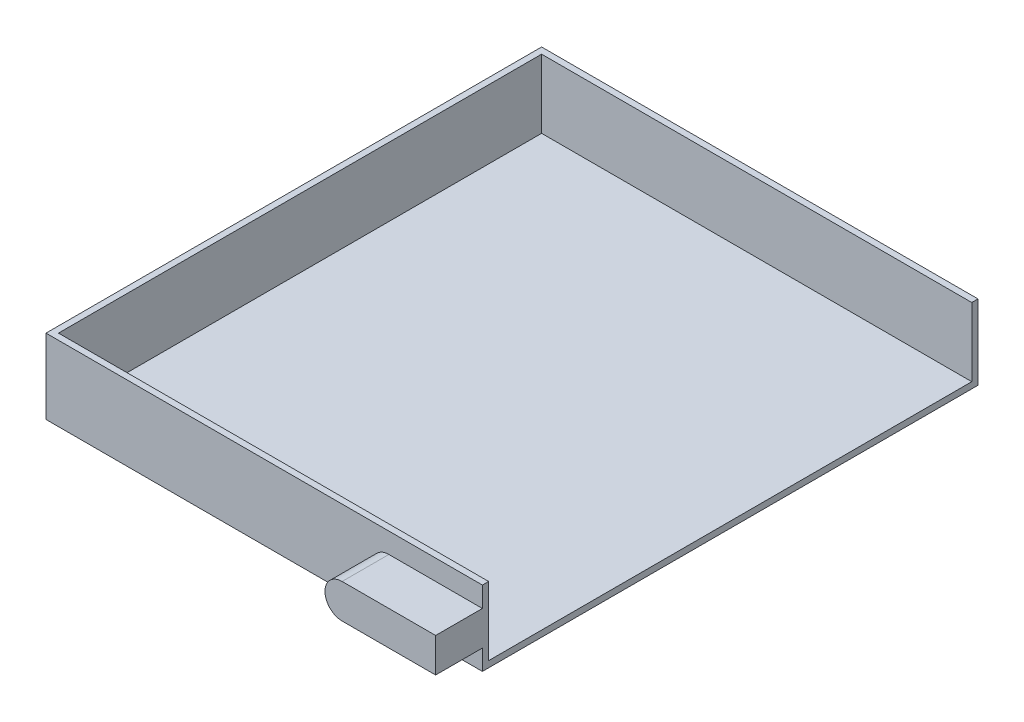
ISO-10303-21;
HEADER;
FILE_DESCRIPTION(('STEP AP214'),'2;1');
FILE_NAME('part.step','',(''),(''),'','','');
FILE_SCHEMA(('AUTOMOTIVE_DESIGN { 1 0 10303 214 1 1 1 1 }'));
ENDSEC;
DATA;
#1=APPLICATION_CONTEXT('core data for automotive mechanical design processes');
#2=APPLICATION_PROTOCOL_DEFINITION('international standard','automotive_design',2000,#1);
#3=PRODUCT_CONTEXT('',#1,'mechanical');
#4=PRODUCT('Part','Part','',(#3));
#5=PRODUCT_RELATED_PRODUCT_CATEGORY('part','',(#4));
#6=PRODUCT_DEFINITION_FORMATION('','',#4);
#7=PRODUCT_DEFINITION_CONTEXT('part definition',#1,'design');
#8=PRODUCT_DEFINITION('design','',#6,#7);
#9=PRODUCT_DEFINITION_SHAPE('','',#8);
#10=(LENGTH_UNIT() NAMED_UNIT(*) SI_UNIT(.MILLI.,.METRE.));
#11=(NAMED_UNIT(*) PLANE_ANGLE_UNIT() SI_UNIT($,.RADIAN.));
#12=(NAMED_UNIT(*) SI_UNIT($,.STERADIAN.) SOLID_ANGLE_UNIT());
#13=UNCERTAINTY_MEASURE_WITH_UNIT(LENGTH_MEASURE(1.E-05),#10,'distance_accuracy_value','');
#14=(GEOMETRIC_REPRESENTATION_CONTEXT(3) GLOBAL_UNCERTAINTY_ASSIGNED_CONTEXT((#13)) GLOBAL_UNIT_ASSIGNED_CONTEXT((#10,
#11,#12)) REPRESENTATION_CONTEXT('',''));
#15=CARTESIAN_POINT('',(0.,0.,0.));
#16=DIRECTION('',(0.,0.,1.));
#17=DIRECTION('',(1.,0.,0.));
#18=AXIS2_PLACEMENT_3D('',#15,#16,#17);
#19=CARTESIAN_POINT('',(0.,22.,157.));
#20=DIRECTION('',(0.,0.,-1.));
#21=DIRECTION('',(-1.,0.,0.));
#22=AXIS2_PLACEMENT_3D('',#19,#20,#21);
#23=PLANE('',#22);
#24=DIRECTION('',(-1.,0.,0.));
#25=VECTOR('',#24,1.);
#26=CARTESIAN_POINT('',(108.,15.5,157.));
#27=LINE('',#26,#25);
#28=CARTESIAN_POINT('',(138.,15.5,157.));
#29=VERTEX_POINT('',#28);
#30=CARTESIAN_POINT('',(108.,15.5,157.));
#31=VERTEX_POINT('',#30);
#32=EDGE_CURVE('E145',#29,#31,#27,.T.);
#33=ORIENTED_EDGE('',*,*,#32,.F.);
#34=DIRECTION('',(0.,-1.,0.));
#35=VECTOR('',#34,1.);
#36=CARTESIAN_POINT('',(138.,22.,157.));
#37=LINE('',#36,#35);
#38=CARTESIAN_POINT('',(138.,22.,157.));
#39=VERTEX_POINT('',#38);
#40=EDGE_CURVE('E46',#39,#29,#37,.T.);
#41=ORIENTED_EDGE('',*,*,#40,.F.);
#42=DIRECTION('',(1.,0.,0.));
#43=VECTOR('',#42,1.);
#44=CARTESIAN_POINT('',(0.,22.,157.));
#45=LINE('',#44,#43);
#46=CARTESIAN_POINT('',(-1.99999999999998,22.,157.));
#47=VERTEX_POINT('',#46);
#48=EDGE_CURVE('E200',#47,#39,#45,.T.);
#49=ORIENTED_EDGE('',*,*,#48,.F.);
#50=DIRECTION('',(0.,-1.,0.));
#51=VECTOR('',#50,1.);
#52=CARTESIAN_POINT('',(-1.99999999999998,22.,157.));
#53=LINE('',#52,#51);
#54=CARTESIAN_POINT('',(-1.99999999999998,-2.,157.));
#55=VERTEX_POINT('',#54);
#56=EDGE_CURVE('E11',#47,#55,#53,.T.);
#57=ORIENTED_EDGE('',*,*,#56,.T.);
#58=DIRECTION('',(1.,0.,0.));
#59=VECTOR('',#58,1.);
#60=CARTESIAN_POINT('',(0.,-2.,157.));
#61=LINE('',#60,#59);
#62=CARTESIAN_POINT('',(138.,-2.,157.));
#63=VERTEX_POINT('',#62);
#64=EDGE_CURVE('E186',#55,#63,#61,.T.);
#65=ORIENTED_EDGE('',*,*,#64,.T.);
#66=CARTESIAN_POINT('',(138.,4.5,157.));
#67=VERTEX_POINT('',#66);
#68=EDGE_CURVE('E204',#67,#63,#37,.T.);
#69=ORIENTED_EDGE('',*,*,#68,.F.);
#70=DIRECTION('',(1.,0.,0.));
#71=VECTOR('',#70,1.);
#72=CARTESIAN_POINT('',(108.,4.5,157.));
#73=LINE('',#72,#71);
#74=CARTESIAN_POINT('',(108.,4.5,157.));
#75=VERTEX_POINT('',#74);
#76=EDGE_CURVE('E59',#75,#67,#73,.T.);
#77=ORIENTED_EDGE('',*,*,#76,.F.);
#78=CARTESIAN_POINT('',(108.,10.,157.));
#79=DIRECTION('',(0.,0.,1.));
#80=DIRECTION('',(1.,0.,0.));
#81=AXIS2_PLACEMENT_3D('',#78,#79,#80);
#82=CIRCLE('',#81,5.5);
#83=EDGE_CURVE('E54',#31,#75,#82,.T.);
#84=ORIENTED_EDGE('',*,*,#83,.F.);
#85=EDGE_LOOP('',(#33,#41,#49,#57,#65,#69,#77,#84));
#86=FACE_BOUND('',#85,.T.);
#87=ADVANCED_FACE('F37',(#86),#23,.F.);
#88=CARTESIAN_POINT('',(-2.,22.,0.));
#89=DIRECTION('',(1.,0.,0.));
#90=DIRECTION('',(0.,0.,-1.));
#91=AXIS2_PLACEMENT_3D('',#88,#89,#90);
#92=PLANE('',#91);
#93=DIRECTION('',(0.,0.,1.));
#94=VECTOR('',#93,1.);
#95=CARTESIAN_POINT('',(-2.,-2.,0.));
#96=LINE('',#95,#94);
#97=CARTESIAN_POINT('',(-2.,-2.,-2.));
#98=VERTEX_POINT('',#97);
#99=EDGE_CURVE('E180',#98,#55,#96,.T.);
#100=ORIENTED_EDGE('',*,*,#99,.T.);
#101=ORIENTED_EDGE('',*,*,#56,.F.);
#102=DIRECTION('',(0.,0.,1.));
#103=VECTOR('',#102,1.);
#104=CARTESIAN_POINT('',(-2.,22.,0.));
#105=LINE('',#104,#103);
#106=CARTESIAN_POINT('',(-2.,22.,-2.));
#107=VERTEX_POINT('',#106);
#108=EDGE_CURVE('E197',#107,#47,#105,.T.);
#109=ORIENTED_EDGE('',*,*,#108,.F.);
#110=DIRECTION('',(0.,-1.,0.));
#111=VECTOR('',#110,1.);
#112=CARTESIAN_POINT('',(-2.,22.,-2.));
#113=LINE('',#112,#111);
#114=EDGE_CURVE('E188',#107,#98,#113,.T.);
#115=ORIENTED_EDGE('',*,*,#114,.T.);
#116=EDGE_LOOP('',(#100,#101,#109,#115));
#117=FACE_BOUND('',#116,.T.);
#118=ADVANCED_FACE('F221',(#117),#92,.F.);
#119=CARTESIAN_POINT('',(138.,22.,0.));
#120=DIRECTION('',(-1.,0.,0.));
#121=DIRECTION('',(0.,0.,1.));
#122=AXIS2_PLACEMENT_3D('',#119,#120,#121);
#123=PLANE('',#122);
#124=DIRECTION('',(0.,0.,-1.));
#125=VECTOR('',#124,1.);
#126=CARTESIAN_POINT('',(138.,22.,0.));
#127=LINE('',#126,#125);
#128=CARTESIAN_POINT('',(138.,22.,0.));
#129=VERTEX_POINT('',#128);
#130=CARTESIAN_POINT('',(138.,22.,-2.));
#131=VERTEX_POINT('',#130);
#132=EDGE_CURVE('E184',#129,#131,#127,.T.);
#133=ORIENTED_EDGE('',*,*,#132,.F.);
#134=DIRECTION('',(0.,-1.,0.));
#135=VECTOR('',#134,1.);
#136=CARTESIAN_POINT('',(138.,22.,0.));
#137=LINE('',#136,#135);
#138=CARTESIAN_POINT('',(138.,0.,0.));
#139=VERTEX_POINT('',#138);
#140=EDGE_CURVE('E171',#129,#139,#137,.T.);
#141=ORIENTED_EDGE('',*,*,#140,.T.);
#142=DIRECTION('',(0.,0.,-1.));
#143=VECTOR('',#142,1.);
#144=CARTESIAN_POINT('',(138.,0.,0.));
#145=LINE('',#144,#143);
#146=CARTESIAN_POINT('',(138.,0.,155.));
#147=VERTEX_POINT('',#146);
#148=EDGE_CURVE('E166',#147,#139,#145,.T.);
#149=ORIENTED_EDGE('',*,*,#148,.F.);
#150=DIRECTION('',(0.,-1.,0.));
#151=VECTOR('',#150,1.);
#152=CARTESIAN_POINT('',(138.,22.,155.));
#153=LINE('',#152,#151);
#154=CARTESIAN_POINT('',(138.,22.,155.));
#155=VERTEX_POINT('',#154);
#156=EDGE_CURVE('E174',#155,#147,#153,.T.);
#157=ORIENTED_EDGE('',*,*,#156,.F.);
#158=EDGE_CURVE('E181',#39,#155,#127,.T.);
#159=ORIENTED_EDGE('',*,*,#158,.F.);
#160=ORIENTED_EDGE('',*,*,#40,.T.);
#161=DIRECTION('',(0.,0.,-1.));
#162=VECTOR('',#161,1.);
#163=CARTESIAN_POINT('',(138.,15.5,172.));
#164=LINE('',#163,#162);
#165=CARTESIAN_POINT('',(138.,15.5,172.));
#166=VERTEX_POINT('',#165);
#167=EDGE_CURVE('E153',#166,#29,#164,.T.);
#168=ORIENTED_EDGE('',*,*,#167,.F.);
#169=DIRECTION('',(0.,1.,0.));
#170=VECTOR('',#169,1.);
#171=CARTESIAN_POINT('',(138.,15.5,172.));
#172=LINE('',#171,#170);
#173=CARTESIAN_POINT('',(138.,4.5,172.));
#174=VERTEX_POINT('',#173);
#175=EDGE_CURVE('E135',#174,#166,#172,.T.);
#176=ORIENTED_EDGE('',*,*,#175,.F.);
#177=DIRECTION('',(0.,0.,-1.));
#178=VECTOR('',#177,1.);
#179=CARTESIAN_POINT('',(138.,4.5,172.));
#180=LINE('',#179,#178);
#181=EDGE_CURVE('E132',#174,#67,#180,.T.);
#182=ORIENTED_EDGE('',*,*,#181,.T.);
#183=ORIENTED_EDGE('',*,*,#68,.T.);
#184=DIRECTION('',(0.,0.,-1.));
#185=VECTOR('',#184,1.);
#186=CARTESIAN_POINT('',(138.,-2.,0.));
#187=LINE('',#186,#185);
#188=CARTESIAN_POINT('',(138.,-2.,-2.));
#189=VERTEX_POINT('',#188);
#190=EDGE_CURVE('E194',#63,#189,#187,.T.);
#191=ORIENTED_EDGE('',*,*,#190,.T.);
#192=DIRECTION('',(0.,-1.,0.));
#193=VECTOR('',#192,1.);
#194=CARTESIAN_POINT('',(138.,22.,-2.));
#195=LINE('',#194,#193);
#196=EDGE_CURVE('E191',#131,#189,#195,.T.);
#197=ORIENTED_EDGE('',*,*,#196,.F.);
#198=EDGE_LOOP('',(#133,#141,#149,#157,#159,#160,#168,#176,#182,#183,#191,#197));
#199=FACE_BOUND('',#198,.T.);
#200=ADVANCED_FACE('F212',(#199),#123,.F.);
#201=CARTESIAN_POINT('',(0.,22.,-2.));
#202=DIRECTION('',(0.,0.,1.));
#203=DIRECTION('',(1.,0.,0.));
#204=AXIS2_PLACEMENT_3D('',#201,#202,#203);
#205=PLANE('',#204);
#206=DIRECTION('',(-1.,0.,0.));
#207=VECTOR('',#206,1.);
#208=CARTESIAN_POINT('',(0.,-2.,-2.));
#209=LINE('',#208,#207);
#210=EDGE_CURVE('E195',#189,#98,#209,.T.);
#211=ORIENTED_EDGE('',*,*,#210,.T.);
#212=ORIENTED_EDGE('',*,*,#114,.F.);
#213=DIRECTION('',(-1.,0.,0.));
#214=VECTOR('',#213,1.);
#215=CARTESIAN_POINT('',(0.,22.,-2.));
#216=LINE('',#215,#214);
#217=EDGE_CURVE('E41',#131,#107,#216,.T.);
#218=ORIENTED_EDGE('',*,*,#217,.F.);
#219=ORIENTED_EDGE('',*,*,#196,.T.);
#220=EDGE_LOOP('',(#211,#212,#218,#219));
#221=FACE_BOUND('',#220,.T.);
#222=ADVANCED_FACE('F218',(#221),#205,.F.);
#223=CARTESIAN_POINT('',(0.,22.,0.));
#224=DIRECTION('',(0.,1.,0.));
#225=DIRECTION('',(0.,0.,1.));
#226=AXIS2_PLACEMENT_3D('',#223,#224,#225);
#227=PLANE('',#226);
#228=DIRECTION('',(1.,0.,0.));
#229=VECTOR('',#228,1.);
#230=CARTESIAN_POINT('',(0.,22.,155.));
#231=LINE('',#230,#229);
#232=CARTESIAN_POINT('',(0.,22.,155.));
#233=VERTEX_POINT('',#232);
#234=EDGE_CURVE('E159',#233,#155,#231,.T.);
#235=ORIENTED_EDGE('',*,*,#234,.F.);
#236=DIRECTION('',(0.,0.,1.));
#237=VECTOR('',#236,1.);
#238=CARTESIAN_POINT('',(0.,22.,0.));
#239=LINE('',#238,#237);
#240=CARTESIAN_POINT('',(0.,22.,0.));
#241=VERTEX_POINT('',#240);
#242=EDGE_CURVE('E157',#241,#233,#239,.T.);
#243=ORIENTED_EDGE('',*,*,#242,.F.);
#244=DIRECTION('',(-1.,0.,0.));
#245=VECTOR('',#244,1.);
#246=CARTESIAN_POINT('',(0.,22.,0.));
#247=LINE('',#246,#245);
#248=EDGE_CURVE('E162',#129,#241,#247,.T.);
#249=ORIENTED_EDGE('',*,*,#248,.F.);
#250=ORIENTED_EDGE('',*,*,#132,.T.);
#251=ORIENTED_EDGE('',*,*,#217,.T.);
#252=ORIENTED_EDGE('',*,*,#108,.T.);
#253=ORIENTED_EDGE('',*,*,#48,.T.);
#254=ORIENTED_EDGE('',*,*,#158,.T.);
#255=EDGE_LOOP('',(#235,#243,#249,#250,#251,#252,#253,#254));
#256=FACE_BOUND('',#255,.T.);
#257=ADVANCED_FACE('F224',(#256),#227,.T.);
#258=CARTESIAN_POINT('',(0.,-2.,0.));
#259=DIRECTION('',(0.,1.,0.));
#260=DIRECTION('',(0.,0.,1.));
#261=AXIS2_PLACEMENT_3D('',#258,#259,#260);
#262=PLANE('',#261);
#263=ORIENTED_EDGE('',*,*,#99,.F.);
#264=ORIENTED_EDGE('',*,*,#210,.F.);
#265=ORIENTED_EDGE('',*,*,#190,.F.);
#266=ORIENTED_EDGE('',*,*,#64,.F.);
#267=EDGE_LOOP('',(#263,#264,#265,#266));
#268=FACE_BOUND('',#267,.T.);
#269=ADVANCED_FACE('F39',(#268),#262,.F.);
#270=CARTESIAN_POINT('',(0.,22.,0.));
#271=DIRECTION('',(1.,0.,0.));
#272=DIRECTION('',(0.,0.,-1.));
#273=AXIS2_PLACEMENT_3D('',#270,#271,#272);
#274=PLANE('',#273);
#275=DIRECTION('',(0.,0.,1.));
#276=VECTOR('',#275,1.);
#277=CARTESIAN_POINT('',(0.,0.,0.));
#278=LINE('',#277,#276);
#279=CARTESIAN_POINT('',(0.,0.,0.));
#280=VERTEX_POINT('',#279);
#281=CARTESIAN_POINT('',(0.,0.,155.));
#282=VERTEX_POINT('',#281);
#283=EDGE_CURVE('E148',#280,#282,#278,.T.);
#284=ORIENTED_EDGE('',*,*,#283,.F.);
#285=DIRECTION('',(0.,-1.,0.));
#286=VECTOR('',#285,1.);
#287=CARTESIAN_POINT('',(0.,22.,0.));
#288=LINE('',#287,#286);
#289=EDGE_CURVE('E163',#241,#280,#288,.T.);
#290=ORIENTED_EDGE('',*,*,#289,.F.);
#291=ORIENTED_EDGE('',*,*,#242,.T.);
#292=DIRECTION('',(0.,-1.,0.));
#293=VECTOR('',#292,1.);
#294=CARTESIAN_POINT('',(0.,22.,155.));
#295=LINE('',#294,#293);
#296=EDGE_CURVE('E177',#233,#282,#295,.T.);
#297=ORIENTED_EDGE('',*,*,#296,.T.);
#298=EDGE_LOOP('',(#284,#290,#291,#297));
#299=FACE_BOUND('',#298,.T.);
#300=ADVANCED_FACE('F242',(#299),#274,.T.);
#301=CARTESIAN_POINT('',(0.,22.,155.));
#302=DIRECTION('',(0.,0.,-1.));
#303=DIRECTION('',(-1.,0.,0.));
#304=AXIS2_PLACEMENT_3D('',#301,#302,#303);
#305=PLANE('',#304);
#306=DIRECTION('',(1.,0.,0.));
#307=VECTOR('',#306,1.);
#308=CARTESIAN_POINT('',(0.,0.,155.));
#309=LINE('',#308,#307);
#310=EDGE_CURVE('E151',#282,#147,#309,.T.);
#311=ORIENTED_EDGE('',*,*,#310,.F.);
#312=ORIENTED_EDGE('',*,*,#296,.F.);
#313=ORIENTED_EDGE('',*,*,#234,.T.);
#314=ORIENTED_EDGE('',*,*,#156,.T.);
#315=EDGE_LOOP('',(#311,#312,#313,#314));
#316=FACE_BOUND('',#315,.T.);
#317=ADVANCED_FACE('F239',(#316),#305,.T.);
#318=CARTESIAN_POINT('',(0.,22.,0.));
#319=DIRECTION('',(0.,0.,1.));
#320=DIRECTION('',(1.,0.,0.));
#321=AXIS2_PLACEMENT_3D('',#318,#319,#320);
#322=PLANE('',#321);
#323=DIRECTION('',(-1.,0.,0.));
#324=VECTOR('',#323,1.);
#325=CARTESIAN_POINT('',(0.,0.,0.));
#326=LINE('',#325,#324);
#327=EDGE_CURVE('E160',#139,#280,#326,.T.);
#328=ORIENTED_EDGE('',*,*,#327,.F.);
#329=ORIENTED_EDGE('',*,*,#140,.F.);
#330=ORIENTED_EDGE('',*,*,#248,.T.);
#331=ORIENTED_EDGE('',*,*,#289,.T.);
#332=EDGE_LOOP('',(#328,#329,#330,#331));
#333=FACE_BOUND('',#332,.T.);
#334=ADVANCED_FACE('F232',(#333),#322,.T.);
#335=CARTESIAN_POINT('',(0.,0.,0.));
#336=DIRECTION('',(0.,1.,0.));
#337=DIRECTION('',(0.,0.,1.));
#338=AXIS2_PLACEMENT_3D('',#335,#336,#337);
#339=PLANE('',#338);
#340=ORIENTED_EDGE('',*,*,#283,.T.);
#341=ORIENTED_EDGE('',*,*,#310,.T.);
#342=ORIENTED_EDGE('',*,*,#148,.T.);
#343=ORIENTED_EDGE('',*,*,#327,.T.);
#344=EDGE_LOOP('',(#340,#341,#342,#343));
#345=FACE_BOUND('',#344,.T.);
#346=ADVANCED_FACE('F236',(#345),#339,.T.);
#347=CARTESIAN_POINT('',(108.,10.,172.));
#348=DIRECTION('',(0.,0.,-1.));
#349=DIRECTION('',(-1.,0.,0.));
#350=AXIS2_PLACEMENT_3D('',#347,#348,#349);
#351=CYLINDRICAL_SURFACE('',#350,5.5);
#352=ORIENTED_EDGE('',*,*,#83,.T.);
#353=DIRECTION('',(0.,0.,-1.));
#354=VECTOR('',#353,1.);
#355=CARTESIAN_POINT('',(108.,4.5,172.));
#356=LINE('',#355,#354);
#357=CARTESIAN_POINT('',(108.,4.5,172.));
#358=VERTEX_POINT('',#357);
#359=EDGE_CURVE('E130',#358,#75,#356,.T.);
#360=ORIENTED_EDGE('',*,*,#359,.F.);
#361=CARTESIAN_POINT('',(108.,10.,172.));
#362=DIRECTION('',(0.,0.,1.));
#363=DIRECTION('',(1.,0.,0.));
#364=AXIS2_PLACEMENT_3D('',#361,#362,#363);
#365=CIRCLE('',#364,5.5);
#366=CARTESIAN_POINT('',(108.,15.5,172.));
#367=VERTEX_POINT('',#366);
#368=EDGE_CURVE('E136',#367,#358,#365,.T.);
#369=ORIENTED_EDGE('',*,*,#368,.F.);
#370=DIRECTION('',(0.,0.,-1.));
#371=VECTOR('',#370,1.);
#372=CARTESIAN_POINT('',(108.,15.5,172.));
#373=LINE('',#372,#371);
#374=EDGE_CURVE('E369',#367,#31,#373,.T.);
#375=ORIENTED_EDGE('',*,*,#374,.T.);
#376=EDGE_LOOP('',(#352,#360,#369,#375));
#377=FACE_BOUND('',#376,.T.);
#378=ADVANCED_FACE('F147',(#377),#351,.T.);
#379=CARTESIAN_POINT('',(108.,4.5,172.));
#380=DIRECTION('',(0.,1.,0.));
#381=DIRECTION('',(0.,0.,1.));
#382=AXIS2_PLACEMENT_3D('',#379,#380,#381);
#383=PLANE('',#382);
#384=ORIENTED_EDGE('',*,*,#76,.T.);
#385=ORIENTED_EDGE('',*,*,#181,.F.);
#386=DIRECTION('',(1.,0.,0.));
#387=VECTOR('',#386,1.);
#388=CARTESIAN_POINT('',(108.,4.5,172.));
#389=LINE('',#388,#387);
#390=EDGE_CURVE('E126',#358,#174,#389,.T.);
#391=ORIENTED_EDGE('',*,*,#390,.F.);
#392=ORIENTED_EDGE('',*,*,#359,.T.);
#393=EDGE_LOOP('',(#384,#385,#391,#392));
#394=FACE_BOUND('',#393,.T.);
#395=ADVANCED_FACE('F128',(#394),#383,.F.);
#396=CARTESIAN_POINT('',(108.,15.5,172.));
#397=DIRECTION('',(0.,-1.,0.));
#398=DIRECTION('',(0.,0.,-1.));
#399=AXIS2_PLACEMENT_3D('',#396,#397,#398);
#400=PLANE('',#399);
#401=ORIENTED_EDGE('',*,*,#32,.T.);
#402=ORIENTED_EDGE('',*,*,#374,.F.);
#403=DIRECTION('',(-1.,0.,0.));
#404=VECTOR('',#403,1.);
#405=CARTESIAN_POINT('',(108.,15.5,172.));
#406=LINE('',#405,#404);
#407=EDGE_CURVE('E141',#166,#367,#406,.T.);
#408=ORIENTED_EDGE('',*,*,#407,.F.);
#409=ORIENTED_EDGE('',*,*,#167,.T.);
#410=EDGE_LOOP('',(#401,#402,#408,#409));
#411=FACE_BOUND('',#410,.T.);
#412=ADVANCED_FACE('F339',(#411),#400,.F.);
#413=CARTESIAN_POINT('',(108.,10.,172.));
#414=DIRECTION('',(0.,0.,1.));
#415=DIRECTION('',(1.,0.,0.));
#416=AXIS2_PLACEMENT_3D('',#413,#414,#415);
#417=PLANE('',#416);
#418=ORIENTED_EDGE('',*,*,#368,.T.);
#419=ORIENTED_EDGE('',*,*,#390,.T.);
#420=ORIENTED_EDGE('',*,*,#175,.T.);
#421=ORIENTED_EDGE('',*,*,#407,.T.);
#422=EDGE_LOOP('',(#418,#419,#420,#421));
#423=FACE_BOUND('',#422,.T.);
#424=ADVANCED_FACE('F139',(#423),#417,.T.);
#425=CLOSED_SHELL('',(#87,#118,#200,#222,#257,#269,#300,#317,#334,#346,#378,#395,#412,#424));
#426=MANIFOLD_SOLID_BREP('B2',#425);
#427=ADVANCED_BREP_SHAPE_REPRESENTATION('',(#18,#426),#14);
#428=SHAPE_DEFINITION_REPRESENTATION(#9,#427);
ENDSEC;
END-ISO-10303-21;
